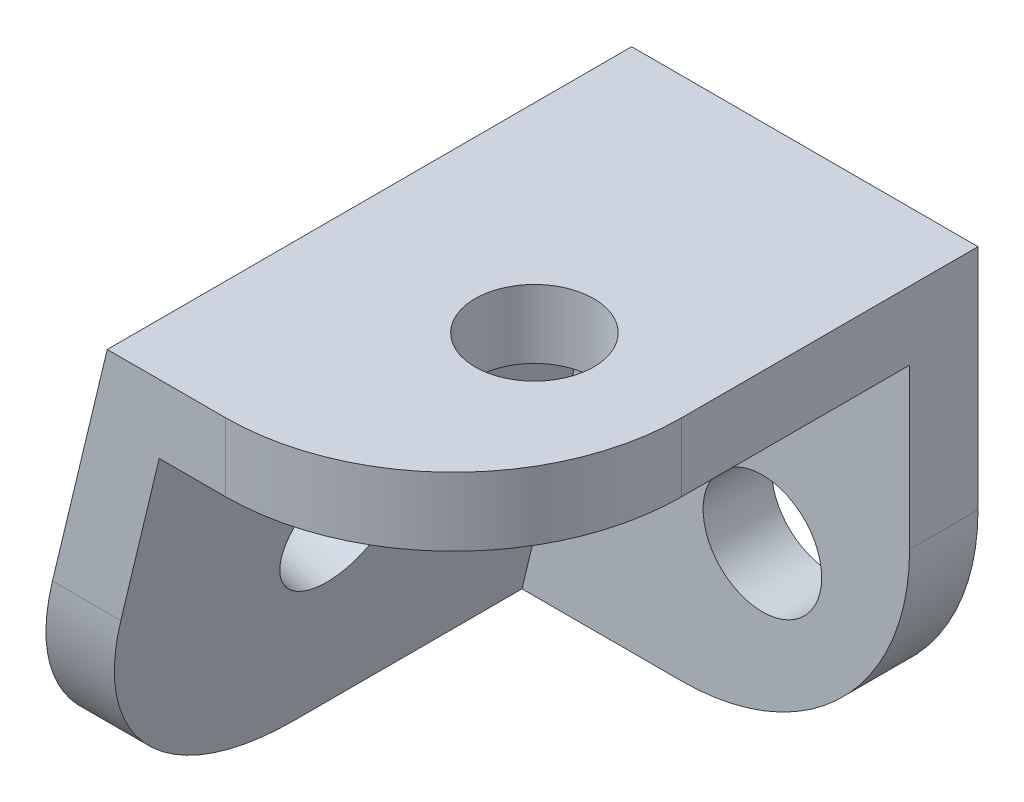
ISO-10303-21;
HEADER;
FILE_DESCRIPTION(('STEP AP214'),'2;1');
FILE_NAME('part.step','',(''),(''),'','','');
FILE_SCHEMA(('AUTOMOTIVE_DESIGN { 1 0 10303 214 1 1 1 1 }'));
ENDSEC;
DATA;
#1=APPLICATION_CONTEXT('core data for automotive mechanical design processes');
#2=APPLICATION_PROTOCOL_DEFINITION('international standard','automotive_design',2000,#1);
#3=PRODUCT_CONTEXT('',#1,'mechanical');
#4=PRODUCT('Part','Part','',(#3));
#5=PRODUCT_RELATED_PRODUCT_CATEGORY('part','',(#4));
#6=PRODUCT_DEFINITION_FORMATION('','',#4);
#7=PRODUCT_DEFINITION_CONTEXT('part definition',#1,'design');
#8=PRODUCT_DEFINITION('design','',#6,#7);
#9=PRODUCT_DEFINITION_SHAPE('','',#8);
#10=(LENGTH_UNIT() NAMED_UNIT(*) SI_UNIT(.MILLI.,.METRE.));
#11=(NAMED_UNIT(*) PLANE_ANGLE_UNIT() SI_UNIT($,.RADIAN.));
#12=(NAMED_UNIT(*) SI_UNIT($,.STERADIAN.) SOLID_ANGLE_UNIT());
#13=UNCERTAINTY_MEASURE_WITH_UNIT(LENGTH_MEASURE(1.E-05),#10,'distance_accuracy_value','');
#14=(GEOMETRIC_REPRESENTATION_CONTEXT(3) GLOBAL_UNCERTAINTY_ASSIGNED_CONTEXT((#13)) GLOBAL_UNIT_ASSIGNED_CONTEXT((#10,
#11,#12)) REPRESENTATION_CONTEXT('',''));
#15=CARTESIAN_POINT('',(0.,0.,0.));
#16=DIRECTION('',(0.,0.,1.));
#17=DIRECTION('',(1.,0.,0.));
#18=AXIS2_PLACEMENT_3D('',#15,#16,#17);
#19=CARTESIAN_POINT('',(0.,0.,3.));
#20=DIRECTION('',(0.,0.,-1.));
#21=DIRECTION('',(-1.,0.,0.));
#22=AXIS2_PLACEMENT_3D('',#19,#20,#21);
#23=PLANE('',#22);
#24=CARTESIAN_POINT('',(-51.1658068315665,479.3,3.));
#25=DIRECTION('',(0.,0.,1.));
#26=DIRECTION('',(1.,0.,0.));
#27=AXIS2_PLACEMENT_3D('',#24,#25,#26);
#28=CIRCLE('',#27,2.59999999999999);
#29=CARTESIAN_POINT('',(-48.5658068315666,479.3,3.));
#30=VERTEX_POINT('',#29);
#31=EDGE_CURVE('E156',#30,#30,#28,.T.);
#32=ORIENTED_EDGE('',*,*,#31,.F.);
#33=EDGE_LOOP('',(#32));
#34=FACE_BOUND('',#33,.T.);
#35=DIRECTION('',(1.,0.,0.));
#36=VECTOR('',#35,1.);
#37=CARTESIAN_POINT('',(-44.709210836278,472.3,3.));
#38=LINE('',#37,#36);
#39=CARTESIAN_POINT('',(-61.709210836278,472.3,3.));
#40=VERTEX_POINT('',#39);
#41=CARTESIAN_POINT('',(-54.709210836278,472.3,3.));
#42=VERTEX_POINT('',#41);
#43=EDGE_CURVE('E135',#40,#42,#38,.T.);
#44=ORIENTED_EDGE('',*,*,#43,.T.);
#45=CARTESIAN_POINT('',(-54.709210836278,482.3,3.));
#46=DIRECTION('',(0.,0.,-1.));
#47=DIRECTION('',(-1.,0.,0.));
#48=AXIS2_PLACEMENT_3D('',#45,#46,#47);
#49=CIRCLE('',#48,10.);
#50=CARTESIAN_POINT('',(-44.709210836278,482.3,3.));
#51=VERTEX_POINT('',#50);
#52=EDGE_CURVE('E130',#42,#51,#49,.F.);
#53=ORIENTED_EDGE('',*,*,#52,.T.);
#54=DIRECTION('',(0.,1.,0.));
#55=VECTOR('',#54,1.);
#56=CARTESIAN_POINT('',(-44.709210836278,492.3,3.));
#57=LINE('',#56,#55);
#58=CARTESIAN_POINT('',(-44.709210836278,489.3,3.));
#59=VERTEX_POINT('',#58);
#60=EDGE_CURVE('E122',#51,#59,#57,.T.);
#61=ORIENTED_EDGE('',*,*,#60,.T.);
#62=DIRECTION('',(1.,0.,0.));
#63=VECTOR('',#62,1.);
#64=CARTESIAN_POINT('',(-44.709210836278,489.3,3.));
#65=LINE('',#64,#63);
#66=CARTESIAN_POINT('',(-57.6224028268551,489.3,3.));
#67=VERTEX_POINT('',#66);
#68=EDGE_CURVE('E127',#67,#59,#65,.T.);
#69=ORIENTED_EDGE('',*,*,#68,.F.);
#70=DIRECTION('',(0.233741106738206,0.972298871243199,0.));
#71=VECTOR('',#70,1.);
#72=CARTESIAN_POINT('',(-61.709210836278,472.3,3.));
#73=LINE('',#72,#71);
#74=EDGE_CURVE('E160',#40,#67,#73,.T.);
#75=ORIENTED_EDGE('',*,*,#74,.F.);
#76=EDGE_LOOP('',(#44,#53,#61,#69,#75));
#77=FACE_BOUND('',#76,.T.);
#78=ADVANCED_FACE('F45',(#34,#77),#23,.F.);
#79=CARTESIAN_POINT('',(-61.709210836278,472.3,23.));
#80=DIRECTION('',(-0.972298871243199,0.233741106738206,0.));
#81=DIRECTION('',(-0.233741106738206,-0.972298871243199,0.));
#82=AXIS2_PLACEMENT_3D('',#79,#80,#81);
#83=PLANE('',#82);
#84=CARTESIAN_POINT('',(-59.6658068315666,480.8,13.));
#85=DIRECTION('',(0.972298871243199,-0.233741106738206,0.));
#86=DIRECTION('',(0.233741106738206,0.972298871243199,0.));
#87=AXIS2_PLACEMENT_3D('',#84,#85,#86);
#88=CIRCLE('',#87,2.59999999999999);
#89=CARTESIAN_POINT('',(-59.0580799540473,483.327977065232,13.));
#90=VERTEX_POINT('',#89);
#91=EDGE_CURVE('E223',#90,#90,#88,.T.);
#92=ORIENTED_EDGE('',*,*,#91,.F.);
#93=EDGE_LOOP('',(#92));
#94=FACE_BOUND('',#93,.T.);
#95=DIRECTION('',(0.233741106738206,0.972298871243199,0.));
#96=VECTOR('',#95,1.);
#97=CARTESIAN_POINT('',(-61.709210836278,472.3,23.));
#98=LINE('',#97,#96);
#99=CARTESIAN_POINT('',(-59.3052061248528,482.3,23.));
#100=VERTEX_POINT('',#99);
#101=CARTESIAN_POINT('',(-57.6224028268551,489.3,23.));
#102=VERTEX_POINT('',#101);
#103=EDGE_CURVE('E166',#100,#102,#98,.T.);
#104=ORIENTED_EDGE('',*,*,#103,.F.);
#105=CARTESIAN_POINT('',(-59.3052061248528,482.3,13.));
#106=DIRECTION('',(-0.972298871243199,0.233741106738206,0.));
#107=DIRECTION('',(-0.233741106738206,-0.972298871243199,0.));
#108=AXIS2_PLACEMENT_3D('',#105,#106,#107);
#109=ELLIPSE('',#108,10.2849034342844,10.);
#110=CARTESIAN_POINT('',(-61.709210836278,472.3,13.));
#111=VERTEX_POINT('',#110);
#112=EDGE_CURVE('E54',#100,#111,#109,.F.);
#113=ORIENTED_EDGE('',*,*,#112,.T.);
#114=DIRECTION('',(0.,0.,-1.));
#115=VECTOR('',#114,1.);
#116=CARTESIAN_POINT('',(-61.709210836278,472.3,23.));
#117=LINE('',#116,#115);
#118=EDGE_CURVE('E168',#111,#40,#117,.T.);
#119=ORIENTED_EDGE('',*,*,#118,.T.);
#120=ORIENTED_EDGE('',*,*,#74,.T.);
#121=DIRECTION('',(0.,0.,-1.));
#122=VECTOR('',#121,1.);
#123=CARTESIAN_POINT('',(-57.6224028268551,489.3,23.));
#124=LINE('',#123,#122);
#125=EDGE_CURVE('E150',#102,#67,#124,.T.);
#126=ORIENTED_EDGE('',*,*,#125,.F.);
#127=EDGE_LOOP('',(#104,#113,#119,#120,#126));
#128=FACE_BOUND('',#127,.T.);
#129=ADVANCED_FACE('F244',(#94,#128),#83,.F.);
#130=CARTESIAN_POINT('',(-59.9012014134276,492.3,3.));
#131=DIRECTION('',(0.,-1.,0.));
#132=DIRECTION('',(0.,0.,-1.));
#133=AXIS2_PLACEMENT_3D('',#130,#131,#132);
#134=PLANE('',#133);
#135=CARTESIAN_POINT('',(-51.1658068315665,492.3,13.));
#136=DIRECTION('',(0.,-1.,0.));
#137=DIRECTION('',(0.,0.,-1.));
#138=AXIS2_PLACEMENT_3D('',#135,#136,#137);
#139=CIRCLE('',#138,2.6);
#140=CARTESIAN_POINT('',(-51.1658068315665,492.3,10.4));
#141=VERTEX_POINT('',#140);
#142=EDGE_CURVE('E213',#141,#141,#139,.T.);
#143=ORIENTED_EDGE('',*,*,#142,.T.);
#144=EDGE_LOOP('',(#143));
#145=FACE_BOUND('',#144,.T.);
#146=DIRECTION('',(-1.,0.,0.));
#147=VECTOR('',#146,1.);
#148=CARTESIAN_POINT('',(-56.9012014134276,492.3,23.));
#149=LINE('',#148,#147);
#150=CARTESIAN_POINT('',(-54.709210836278,492.3,23.));
#151=VERTEX_POINT('',#150);
#152=CARTESIAN_POINT('',(-59.9012014134276,492.3,23.));
#153=VERTEX_POINT('',#152);
#154=EDGE_CURVE('E161',#151,#153,#149,.T.);
#155=ORIENTED_EDGE('',*,*,#154,.F.);
#156=CARTESIAN_POINT('',(-54.709210836278,492.3,13.));
#157=DIRECTION('',(0.,-1.,0.));
#158=DIRECTION('',(0.,0.,-1.));
#159=AXIS2_PLACEMENT_3D('',#156,#157,#158);
#160=CIRCLE('',#159,10.);
#161=CARTESIAN_POINT('',(-44.709210836278,492.3,13.));
#162=VERTEX_POINT('',#161);
#163=EDGE_CURVE('E196',#151,#162,#160,.F.);
#164=ORIENTED_EDGE('',*,*,#163,.T.);
#165=DIRECTION('',(0.,0.,-1.));
#166=VECTOR('',#165,1.);
#167=CARTESIAN_POINT('',(-44.709210836278,492.3,3.));
#168=LINE('',#167,#166);
#169=CARTESIAN_POINT('',(-44.709210836278,492.3,0.));
#170=VERTEX_POINT('',#169);
#171=EDGE_CURVE('E134',#162,#170,#168,.T.);
#172=ORIENTED_EDGE('',*,*,#171,.T.);
#173=DIRECTION('',(-1.,0.,0.));
#174=VECTOR('',#173,1.);
#175=CARTESIAN_POINT('',(-59.9012014134276,492.3,0.));
#176=LINE('',#175,#174);
#177=CARTESIAN_POINT('',(-59.9012014134276,492.3,0.));
#178=VERTEX_POINT('',#177);
#179=EDGE_CURVE('E171',#170,#178,#176,.T.);
#180=ORIENTED_EDGE('',*,*,#179,.T.);
#181=DIRECTION('',(0.,0.,-1.));
#182=VECTOR('',#181,1.);
#183=CARTESIAN_POINT('',(-59.9012014134276,492.3,3.));
#184=LINE('',#183,#182);
#185=EDGE_CURVE('E187',#153,#178,#184,.T.);
#186=ORIENTED_EDGE('',*,*,#185,.F.);
#187=EDGE_LOOP('',(#155,#164,#172,#180,#186));
#188=FACE_BOUND('',#187,.T.);
#189=ADVANCED_FACE('F250',(#145,#188),#134,.F.);
#190=CARTESIAN_POINT('',(-64.709210836278,472.3,3.));
#191=DIRECTION('',(0.972298871243199,-0.233741106738206,0.));
#192=DIRECTION('',(0.233741106738206,0.972298871243199,0.));
#193=AXIS2_PLACEMENT_3D('',#190,#191,#192);
#194=PLANE('',#193);
#195=CARTESIAN_POINT('',(-62.5019021166289,481.481798642734,13.));
#196=DIRECTION('',(0.972298871243199,-0.233741106738206,0.));
#197=DIRECTION('',(0.233741106738206,0.972298871243199,0.));
#198=AXIS2_PLACEMENT_3D('',#195,#196,#197);
#199=CIRCLE('',#198,2.59999999999999);
#200=CARTESIAN_POINT('',(-61.8941752391096,484.009775707966,13.));
#201=VERTEX_POINT('',#200);
#202=EDGE_CURVE('E49',#201,#201,#199,.T.);
#203=ORIENTED_EDGE('',*,*,#202,.T.);
#204=EDGE_LOOP('',(#203));
#205=FACE_BOUND('',#204,.T.);
#206=DIRECTION('',(0.,0.,-1.));
#207=VECTOR('',#206,1.);
#208=CARTESIAN_POINT('',(-64.709210836278,472.3,3.));
#209=LINE('',#208,#207);
#210=CARTESIAN_POINT('',(-64.709210836278,472.3,13.));
#211=VERTEX_POINT('',#210);
#212=CARTESIAN_POINT('',(-64.709210836278,472.3,0.));
#213=VERTEX_POINT('',#212);
#214=EDGE_CURVE('E185',#211,#213,#209,.T.);
#215=ORIENTED_EDGE('',*,*,#214,.F.);
#216=CARTESIAN_POINT('',(-62.3052061248528,482.3,13.));
#217=DIRECTION('',(0.972298871243199,-0.233741106738206,0.));
#218=DIRECTION('',(-0.233741106738206,-0.972298871243199,0.));
#219=AXIS2_PLACEMENT_3D('',#216,#217,#218);
#220=ELLIPSE('',#219,10.2849034342844,10.);
#221=CARTESIAN_POINT('',(-62.3052061248528,482.3,23.));
#222=VERTEX_POINT('',#221);
#223=EDGE_CURVE('E13',#211,#222,#220,.F.);
#224=ORIENTED_EDGE('',*,*,#223,.T.);
#225=DIRECTION('',(-0.233741106738206,-0.972298871243199,0.));
#226=VECTOR('',#225,1.);
#227=CARTESIAN_POINT('',(-59.9012014134276,492.3,23.));
#228=LINE('',#227,#226);
#229=EDGE_CURVE('E163',#153,#222,#228,.T.);
#230=ORIENTED_EDGE('',*,*,#229,.F.);
#231=ORIENTED_EDGE('',*,*,#185,.T.);
#232=DIRECTION('',(-0.233741106738206,-0.972298871243199,0.));
#233=VECTOR('',#232,1.);
#234=CARTESIAN_POINT('',(-64.709210836278,472.3,0.));
#235=LINE('',#234,#233);
#236=EDGE_CURVE('E176',#178,#213,#235,.T.);
#237=ORIENTED_EDGE('',*,*,#236,.T.);
#238=EDGE_LOOP('',(#215,#224,#230,#231,#237));
#239=FACE_BOUND('',#238,.T.);
#240=ADVANCED_FACE('F230',(#205,#239),#194,.F.);
#241=CARTESIAN_POINT('',(-44.709210836278,472.3,3.));
#242=DIRECTION('',(0.,1.,0.));
#243=DIRECTION('',(0.,0.,1.));
#244=AXIS2_PLACEMENT_3D('',#241,#242,#243);
#245=PLANE('',#244);
#246=DIRECTION('',(1.,0.,0.));
#247=VECTOR('',#246,1.);
#248=CARTESIAN_POINT('',(-44.709210836278,472.3,0.));
#249=LINE('',#248,#247);
#250=CARTESIAN_POINT('',(-54.709210836278,472.3,0.));
#251=VERTEX_POINT('',#250);
#252=EDGE_CURVE('E179',#213,#251,#249,.T.);
#253=ORIENTED_EDGE('',*,*,#252,.T.);
#254=DIRECTION('',(0.,0.,-1.));
#255=VECTOR('',#254,1.);
#256=CARTESIAN_POINT('',(-54.709210836278,472.3,3.));
#257=LINE('',#256,#255);
#258=EDGE_CURVE('E206',#251,#42,#257,.F.);
#259=ORIENTED_EDGE('',*,*,#258,.T.);
#260=ORIENTED_EDGE('',*,*,#43,.F.);
#261=ORIENTED_EDGE('',*,*,#118,.F.);
#262=DIRECTION('',(1.,0.,0.));
#263=VECTOR('',#262,1.);
#264=CARTESIAN_POINT('',(-64.709210836278,472.3,13.));
#265=LINE('',#264,#263);
#266=EDGE_CURVE('E62',#111,#211,#265,.F.);
#267=ORIENTED_EDGE('',*,*,#266,.T.);
#268=ORIENTED_EDGE('',*,*,#214,.T.);
#269=EDGE_LOOP('',(#253,#259,#260,#261,#267,#268));
#270=FACE_BOUND('',#269,.T.);
#271=ADVANCED_FACE('F262',(#270),#245,.F.);
#272=CARTESIAN_POINT('',(-44.709210836278,492.3,3.));
#273=DIRECTION('',(-1.,0.,0.));
#274=DIRECTION('',(0.,0.,1.));
#275=AXIS2_PLACEMENT_3D('',#272,#273,#274);
#276=PLANE('',#275);
#277=ORIENTED_EDGE('',*,*,#171,.F.);
#278=DIRECTION('',(0.,1.,0.));
#279=VECTOR('',#278,1.);
#280=CARTESIAN_POINT('',(-44.709210836278,489.3,13.));
#281=LINE('',#280,#279);
#282=CARTESIAN_POINT('',(-44.709210836278,489.3,13.));
#283=VERTEX_POINT('',#282);
#284=EDGE_CURVE('E142',#162,#283,#281,.F.);
#285=ORIENTED_EDGE('',*,*,#284,.T.);
#286=DIRECTION('',(0.,0.,-1.));
#287=VECTOR('',#286,1.);
#288=CARTESIAN_POINT('',(-44.709210836278,489.3,37.7784890642073));
#289=LINE('',#288,#287);
#290=EDGE_CURVE('E138',#283,#59,#289,.T.);
#291=ORIENTED_EDGE('',*,*,#290,.T.);
#292=ORIENTED_EDGE('',*,*,#60,.F.);
#293=DIRECTION('',(0.,0.,-1.));
#294=VECTOR('',#293,1.);
#295=CARTESIAN_POINT('',(-44.709210836278,482.3,3.));
#296=LINE('',#295,#294);
#297=CARTESIAN_POINT('',(-44.709210836278,482.3,0.));
#298=VERTEX_POINT('',#297);
#299=EDGE_CURVE('E198',#51,#298,#296,.T.);
#300=ORIENTED_EDGE('',*,*,#299,.T.);
#301=DIRECTION('',(0.,1.,0.));
#302=VECTOR('',#301,1.);
#303=CARTESIAN_POINT('',(-44.709210836278,492.3,0.));
#304=LINE('',#303,#302);
#305=EDGE_CURVE('E172',#298,#170,#304,.T.);
#306=ORIENTED_EDGE('',*,*,#305,.T.);
#307=EDGE_LOOP('',(#277,#285,#291,#292,#300,#306));
#308=FACE_BOUND('',#307,.T.);
#309=ADVANCED_FACE('F140',(#308),#276,.F.);
#310=CARTESIAN_POINT('',(0.,0.,0.));
#311=DIRECTION('',(0.,0.,-1.));
#312=DIRECTION('',(-1.,0.,0.));
#313=AXIS2_PLACEMENT_3D('',#310,#311,#312);
#314=PLANE('',#313);
#315=CARTESIAN_POINT('',(-51.1658068315665,479.3,0.));
#316=DIRECTION('',(0.,0.,-1.));
#317=DIRECTION('',(-1.,0.,0.));
#318=AXIS2_PLACEMENT_3D('',#315,#316,#317);
#319=CIRCLE('',#318,2.59999999999999);
#320=CARTESIAN_POINT('',(-53.7658068315665,479.3,0.));
#321=VERTEX_POINT('',#320);
#322=EDGE_CURVE('E145',#321,#321,#319,.T.);
#323=ORIENTED_EDGE('',*,*,#322,.F.);
#324=EDGE_LOOP('',(#323));
#325=FACE_BOUND('',#324,.T.);
#326=ORIENTED_EDGE('',*,*,#305,.F.);
#327=CARTESIAN_POINT('',(-54.709210836278,482.3,0.));
#328=DIRECTION('',(0.,0.,-1.));
#329=DIRECTION('',(-1.,0.,0.));
#330=AXIS2_PLACEMENT_3D('',#327,#328,#329);
#331=CIRCLE('',#330,10.);
#332=EDGE_CURVE('E203',#298,#251,#331,.T.);
#333=ORIENTED_EDGE('',*,*,#332,.T.);
#334=ORIENTED_EDGE('',*,*,#252,.F.);
#335=ORIENTED_EDGE('',*,*,#236,.F.);
#336=ORIENTED_EDGE('',*,*,#179,.F.);
#337=EDGE_LOOP('',(#326,#333,#334,#335,#336));
#338=FACE_BOUND('',#337,.T.);
#339=ADVANCED_FACE('F255',(#325,#338),#314,.T.);
#340=CARTESIAN_POINT('',(0.,0.,23.));
#341=DIRECTION('',(0.,0.,1.));
#342=DIRECTION('',(1.,0.,0.));
#343=AXIS2_PLACEMENT_3D('',#340,#341,#342);
#344=PLANE('',#343);
#345=DIRECTION('',(1.,0.,0.));
#346=VECTOR('',#345,1.);
#347=CARTESIAN_POINT('',(-44.709210836278,489.3,23.));
#348=LINE('',#347,#346);
#349=CARTESIAN_POINT('',(-54.709210836278,489.3,23.));
#350=VERTEX_POINT('',#349);
#351=EDGE_CURVE('E151',#102,#350,#348,.T.);
#352=ORIENTED_EDGE('',*,*,#351,.T.);
#353=DIRECTION('',(0.,1.,0.));
#354=VECTOR('',#353,1.);
#355=CARTESIAN_POINT('',(-54.709210836278,492.3,23.));
#356=LINE('',#355,#354);
#357=EDGE_CURVE('E193',#350,#151,#356,.T.);
#358=ORIENTED_EDGE('',*,*,#357,.T.);
#359=ORIENTED_EDGE('',*,*,#154,.T.);
#360=ORIENTED_EDGE('',*,*,#229,.T.);
#361=DIRECTION('',(1.,0.,0.));
#362=VECTOR('',#361,1.);
#363=CARTESIAN_POINT('',(-61.709210836278,482.3,23.));
#364=LINE('',#363,#362);
#365=EDGE_CURVE('E190',#222,#100,#364,.T.);
#366=ORIENTED_EDGE('',*,*,#365,.T.);
#367=ORIENTED_EDGE('',*,*,#103,.T.);
#368=EDGE_LOOP('',(#352,#358,#359,#360,#366,#367));
#369=FACE_BOUND('',#368,.T.);
#370=ADVANCED_FACE('F258',(#369),#344,.T.);
#371=CARTESIAN_POINT('',(-44.709210836278,489.3,37.7784890642073));
#372=DIRECTION('',(0.,1.,0.));
#373=DIRECTION('',(0.,0.,1.));
#374=AXIS2_PLACEMENT_3D('',#371,#372,#373);
#375=PLANE('',#374);
#376=CARTESIAN_POINT('',(-51.1658068315665,489.3,13.));
#377=DIRECTION('',(0.,-1.,0.));
#378=DIRECTION('',(0.,0.,-1.));
#379=AXIS2_PLACEMENT_3D('',#376,#377,#378);
#380=CIRCLE('',#379,2.6);
#381=CARTESIAN_POINT('',(-51.1658068315665,489.3,10.4));
#382=VERTEX_POINT('',#381);
#383=EDGE_CURVE('E217',#382,#382,#380,.T.);
#384=ORIENTED_EDGE('',*,*,#383,.F.);
#385=EDGE_LOOP('',(#384));
#386=FACE_BOUND('',#385,.T.);
#387=ORIENTED_EDGE('',*,*,#290,.F.);
#388=CARTESIAN_POINT('',(-54.709210836278,489.3,13.));
#389=DIRECTION('',(0.,1.,0.));
#390=DIRECTION('',(0.,0.,1.));
#391=AXIS2_PLACEMENT_3D('',#388,#389,#390);
#392=CIRCLE('',#391,10.);
#393=EDGE_CURVE('E201',#283,#350,#392,.F.);
#394=ORIENTED_EDGE('',*,*,#393,.T.);
#395=ORIENTED_EDGE('',*,*,#351,.F.);
#396=ORIENTED_EDGE('',*,*,#125,.T.);
#397=ORIENTED_EDGE('',*,*,#68,.T.);
#398=EDGE_LOOP('',(#387,#394,#395,#396,#397));
#399=FACE_BOUND('',#398,.T.);
#400=ADVANCED_FACE('F147',(#386,#399),#375,.F.);
#401=CARTESIAN_POINT('',(-54.709210836278,0.,13.));
#402=DIRECTION('',(0.,-1.,0.));
#403=DIRECTION('',(0.,0.,-1.));
#404=AXIS2_PLACEMENT_3D('',#401,#402,#403);
#405=CYLINDRICAL_SURFACE('',#404,10.);
#406=ORIENTED_EDGE('',*,*,#393,.F.);
#407=ORIENTED_EDGE('',*,*,#284,.F.);
#408=ORIENTED_EDGE('',*,*,#163,.F.);
#409=ORIENTED_EDGE('',*,*,#357,.F.);
#410=EDGE_LOOP('',(#406,#407,#408,#409));
#411=FACE_BOUND('',#410,.T.);
#412=ADVANCED_FACE('F269',(#411),#405,.T.);
#413=CARTESIAN_POINT('',(-54.709210836278,482.3,3.));
#414=DIRECTION('',(0.,0.,-1.));
#415=DIRECTION('',(-1.,0.,0.));
#416=AXIS2_PLACEMENT_3D('',#413,#414,#415);
#417=CYLINDRICAL_SURFACE('',#416,10.);
#418=ORIENTED_EDGE('',*,*,#52,.F.);
#419=ORIENTED_EDGE('',*,*,#258,.F.);
#420=ORIENTED_EDGE('',*,*,#332,.F.);
#421=ORIENTED_EDGE('',*,*,#299,.F.);
#422=EDGE_LOOP('',(#418,#419,#420,#421));
#423=FACE_BOUND('',#422,.T.);
#424=ADVANCED_FACE('F271',(#423),#417,.T.);
#425=CARTESIAN_POINT('',(0.,482.3,13.));
#426=DIRECTION('',(-1.,0.,0.));
#427=DIRECTION('',(0.,0.,1.));
#428=AXIS2_PLACEMENT_3D('',#425,#426,#427);
#429=CYLINDRICAL_SURFACE('',#428,10.);
#430=ORIENTED_EDGE('',*,*,#223,.F.);
#431=ORIENTED_EDGE('',*,*,#266,.F.);
#432=ORIENTED_EDGE('',*,*,#112,.F.);
#433=ORIENTED_EDGE('',*,*,#365,.F.);
#434=EDGE_LOOP('',(#430,#431,#432,#433));
#435=FACE_BOUND('',#434,.T.);
#436=ADVANCED_FACE('F47',(#435),#429,.T.);
#437=CARTESIAN_POINT('',(-51.1658068315665,479.3,-17.));
#438=DIRECTION('',(0.,0.,1.));
#439=DIRECTION('',(1.,0.,0.));
#440=AXIS2_PLACEMENT_3D('',#437,#438,#439);
#441=CYLINDRICAL_SURFACE('',#440,2.59999999999999);
#442=ORIENTED_EDGE('',*,*,#322,.T.);
#443=EDGE_LOOP('',(#442));
#444=FACE_BOUND('',#443,.T.);
#445=ORIENTED_EDGE('',*,*,#31,.T.);
#446=EDGE_LOOP('',(#445));
#447=FACE_BOUND('',#446,.T.);
#448=ADVANCED_FACE('F240',(#444,#447),#441,.F.);
#449=CARTESIAN_POINT('',(-51.1658068315665,509.3,13.));
#450=DIRECTION('',(0.,-1.,0.));
#451=DIRECTION('',(0.,0.,-1.));
#452=AXIS2_PLACEMENT_3D('',#449,#450,#451);
#453=CYLINDRICAL_SURFACE('',#452,2.6);
#454=ORIENTED_EDGE('',*,*,#383,.T.);
#455=EDGE_LOOP('',(#454));
#456=FACE_BOUND('',#455,.T.);
#457=ORIENTED_EDGE('',*,*,#142,.F.);
#458=EDGE_LOOP('',(#457));
#459=FACE_BOUND('',#458,.T.);
#460=ADVANCED_FACE('F235',(#456,#459),#453,.F.);
#461=CARTESIAN_POINT('',(-79.1117842564306,485.474822134764,13.));
#462=DIRECTION('',(0.972298871243199,-0.233741106738206,0.));
#463=DIRECTION('',(0.233741106738206,0.972298871243199,0.));
#464=AXIS2_PLACEMENT_3D('',#461,#462,#463);
#465=CYLINDRICAL_SURFACE('',#464,2.59999999999999);
#466=ORIENTED_EDGE('',*,*,#91,.T.);
#467=EDGE_LOOP('',(#466));
#468=FACE_BOUND('',#467,.T.);
#469=ORIENTED_EDGE('',*,*,#202,.F.);
#470=EDGE_LOOP('',(#469));
#471=FACE_BOUND('',#470,.T.);
#472=ADVANCED_FACE('F233',(#468,#471),#465,.F.);
#473=CLOSED_SHELL('',(#78,#129,#189,#240,#271,#309,#339,#370,#400,#412,#424,#436,#448,#460,#472));
#474=MANIFOLD_SOLID_BREP('B2',#473);
#475=ADVANCED_BREP_SHAPE_REPRESENTATION('',(#18,#474),#14);
#476=SHAPE_DEFINITION_REPRESENTATION(#9,#475);
ENDSEC;
END-ISO-10303-21;
